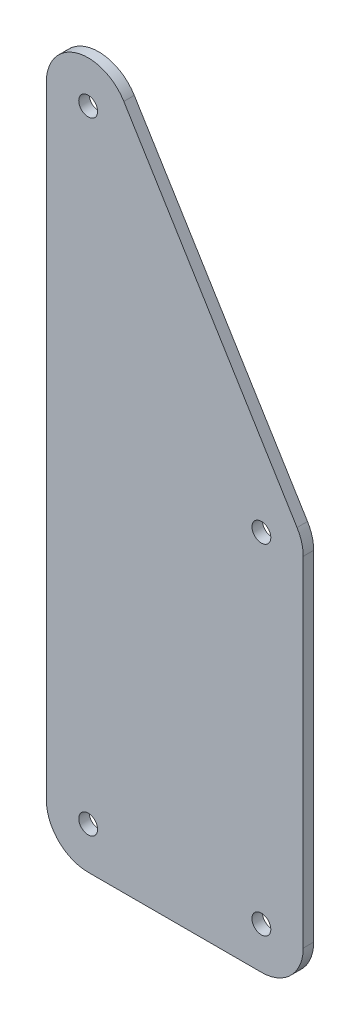
ISO-10303-21;
HEADER;
FILE_DESCRIPTION(('STEP AP214'),'2;1');
FILE_NAME('part.step','',(''),(''),'','','');
FILE_SCHEMA(('AUTOMOTIVE_DESIGN { 1 0 10303 214 1 1 1 1 }'));
ENDSEC;
DATA;
#1=APPLICATION_CONTEXT('core data for automotive mechanical design processes');
#2=APPLICATION_PROTOCOL_DEFINITION('international standard','automotive_design',2000,#1);
#3=PRODUCT_CONTEXT('',#1,'mechanical');
#4=PRODUCT('Part','Part','',(#3));
#5=PRODUCT_RELATED_PRODUCT_CATEGORY('part','',(#4));
#6=PRODUCT_DEFINITION_FORMATION('','',#4);
#7=PRODUCT_DEFINITION_CONTEXT('part definition',#1,'design');
#8=PRODUCT_DEFINITION('design','',#6,#7);
#9=PRODUCT_DEFINITION_SHAPE('','',#8);
#10=(LENGTH_UNIT() NAMED_UNIT(*) SI_UNIT(.MILLI.,.METRE.));
#11=(NAMED_UNIT(*) PLANE_ANGLE_UNIT() SI_UNIT($,.RADIAN.));
#12=(NAMED_UNIT(*) SI_UNIT($,.STERADIAN.) SOLID_ANGLE_UNIT());
#13=UNCERTAINTY_MEASURE_WITH_UNIT(LENGTH_MEASURE(1.E-05),#10,'distance_accuracy_value','');
#14=(GEOMETRIC_REPRESENTATION_CONTEXT(3) GLOBAL_UNCERTAINTY_ASSIGNED_CONTEXT((#13)) GLOBAL_UNIT_ASSIGNED_CONTEXT((#10,
#11,#12)) REPRESENTATION_CONTEXT('',''));
#15=CARTESIAN_POINT('',(0.,0.,0.));
#16=DIRECTION('',(0.,0.,1.));
#17=DIRECTION('',(1.,0.,0.));
#18=AXIS2_PLACEMENT_3D('',#15,#16,#17);
#19=CARTESIAN_POINT('',(32.,507.485708837795,-8.));
#20=DIRECTION('',(0.,0.,1.));
#21=DIRECTION('',(-1.,0.,0.));
#22=AXIS2_PLACEMENT_3D('',#19,#20,#21);
#23=CYLINDRICAL_SURFACE('',#22,32.);
#24=CARTESIAN_POINT('',(32.,507.485708837795,0.));
#25=DIRECTION('',(0.,0.,1.));
#26=DIRECTION('',(-1.,0.,0.));
#27=AXIS2_PLACEMENT_3D('',#24,#25,#26);
#28=CIRCLE('',#27,32.);
#29=CARTESIAN_POINT('',(59.2779224328877,524.216367753252,0.));
#30=VERTEX_POINT('',#29);
#31=CARTESIAN_POINT('',(0.,507.485708837794,0.));
#32=VERTEX_POINT('',#31);
#33=EDGE_CURVE('E139',#30,#32,#28,.T.);
#34=ORIENTED_EDGE('',*,*,#33,.F.);
#35=DIRECTION('',(0.,0.,1.));
#36=VECTOR('',#35,1.);
#37=CARTESIAN_POINT('',(59.2779224328877,524.216367753252,-8.));
#38=LINE('',#37,#36);
#39=CARTESIAN_POINT('',(59.2779224328877,524.216367753252,-8.));
#40=VERTEX_POINT('',#39);
#41=EDGE_CURVE('E138',#40,#30,#38,.T.);
#42=ORIENTED_EDGE('',*,*,#41,.F.);
#43=CARTESIAN_POINT('',(32.,507.485708837795,-8.));
#44=DIRECTION('',(0.,0.,1.));
#45=DIRECTION('',(-1.,0.,0.));
#46=AXIS2_PLACEMENT_3D('',#43,#44,#45);
#47=CIRCLE('',#46,32.);
#48=CARTESIAN_POINT('',(0.,507.485708837794,-8.));
#49=VERTEX_POINT('',#48);
#50=EDGE_CURVE('E158',#40,#49,#47,.T.);
#51=ORIENTED_EDGE('',*,*,#50,.T.);
#52=DIRECTION('',(0.,0.,1.));
#53=VECTOR('',#52,1.);
#54=CARTESIAN_POINT('',(0.,507.485708837794,-8.));
#55=LINE('',#54,#53);
#56=EDGE_CURVE('E11',#49,#32,#55,.T.);
#57=ORIENTED_EDGE('',*,*,#56,.T.);
#58=EDGE_LOOP('',(#34,#42,#51,#57));
#59=FACE_BOUND('',#58,.T.);
#60=ADVANCED_FACE('F43',(#59),#23,.T.);
#61=CARTESIAN_POINT('',(0.,32.0000000000002,-8.));
#62=DIRECTION('',(1.,0.,0.));
#63=DIRECTION('',(0.,0.,1.));
#64=AXIS2_PLACEMENT_3D('',#61,#62,#63);
#65=PLANE('',#64);
#66=DIRECTION('',(0.,-1.,0.));
#67=VECTOR('',#66,1.);
#68=CARTESIAN_POINT('',(0.,32.0000000000002,0.));
#69=LINE('',#68,#67);
#70=CARTESIAN_POINT('',(0.,32.0000000000002,0.));
#71=VERTEX_POINT('',#70);
#72=EDGE_CURVE('E143',#32,#71,#69,.T.);
#73=ORIENTED_EDGE('',*,*,#72,.F.);
#74=ORIENTED_EDGE('',*,*,#56,.F.);
#75=DIRECTION('',(0.,-1.,0.));
#76=VECTOR('',#75,1.);
#77=CARTESIAN_POINT('',(0.,32.0000000000002,-8.));
#78=LINE('',#77,#76);
#79=CARTESIAN_POINT('',(0.,32.0000000000002,-8.));
#80=VERTEX_POINT('',#79);
#81=EDGE_CURVE('E100',#49,#80,#78,.T.);
#82=ORIENTED_EDGE('',*,*,#81,.T.);
#83=DIRECTION('',(0.,0.,1.));
#84=VECTOR('',#83,1.);
#85=CARTESIAN_POINT('',(0.,32.0000000000002,-8.));
#86=LINE('',#85,#84);
#87=EDGE_CURVE('E51',#80,#71,#86,.T.);
#88=ORIENTED_EDGE('',*,*,#87,.T.);
#89=EDGE_LOOP('',(#73,#74,#82,#88));
#90=FACE_BOUND('',#89,.T.);
#91=ADVANCED_FACE('F168',(#90),#65,.F.);
#92=CARTESIAN_POINT('',(32.,32.,-8.));
#93=DIRECTION('',(0.,0.,1.));
#94=DIRECTION('',(-1.,0.,0.));
#95=AXIS2_PLACEMENT_3D('',#92,#93,#94);
#96=CYLINDRICAL_SURFACE('',#95,32.);
#97=CARTESIAN_POINT('',(32.,32.,0.));
#98=DIRECTION('',(0.,0.,1.));
#99=DIRECTION('',(-1.,0.,0.));
#100=AXIS2_PLACEMENT_3D('',#97,#98,#99);
#101=CIRCLE('',#100,32.);
#102=CARTESIAN_POINT('',(32.0000000000002,0.,0.));
#103=VERTEX_POINT('',#102);
#104=EDGE_CURVE('E144',#71,#103,#101,.T.);
#105=ORIENTED_EDGE('',*,*,#104,.F.);
#106=ORIENTED_EDGE('',*,*,#87,.F.);
#107=CARTESIAN_POINT('',(32.,32.,-8.));
#108=DIRECTION('',(0.,0.,1.));
#109=DIRECTION('',(-1.,0.,0.));
#110=AXIS2_PLACEMENT_3D('',#107,#108,#109);
#111=CIRCLE('',#110,32.);
#112=CARTESIAN_POINT('',(32.0000000000002,0.,-8.));
#113=VERTEX_POINT('',#112);
#114=EDGE_CURVE('E179',#80,#113,#111,.T.);
#115=ORIENTED_EDGE('',*,*,#114,.T.);
#116=DIRECTION('',(0.,0.,1.));
#117=VECTOR('',#116,1.);
#118=CARTESIAN_POINT('',(32.0000000000002,0.,-8.));
#119=LINE('',#118,#117);
#120=EDGE_CURVE('E164',#113,#103,#119,.T.);
#121=ORIENTED_EDGE('',*,*,#120,.T.);
#122=EDGE_LOOP('',(#105,#106,#115,#121));
#123=FACE_BOUND('',#122,.T.);
#124=ADVANCED_FACE('F192',(#123),#96,.T.);
#125=CARTESIAN_POINT('',(32.0000000000002,0.,-8.));
#126=DIRECTION('',(0.,1.,0.));
#127=DIRECTION('',(0.,0.,-1.));
#128=AXIS2_PLACEMENT_3D('',#125,#126,#127);
#129=PLANE('',#128);
#130=DIRECTION('',(1.,0.,0.));
#131=VECTOR('',#130,1.);
#132=CARTESIAN_POINT('',(32.0000000000002,0.,0.));
#133=LINE('',#132,#131);
#134=CARTESIAN_POINT('',(164.48,0.,0.));
#135=VERTEX_POINT('',#134);
#136=EDGE_CURVE('E146',#103,#135,#133,.T.);
#137=ORIENTED_EDGE('',*,*,#136,.F.);
#138=ORIENTED_EDGE('',*,*,#120,.F.);
#139=DIRECTION('',(1.,0.,0.));
#140=VECTOR('',#139,1.);
#141=CARTESIAN_POINT('',(32.0000000000002,0.,-8.));
#142=LINE('',#141,#140);
#143=CARTESIAN_POINT('',(164.48,0.,-8.));
#144=VERTEX_POINT('',#143);
#145=EDGE_CURVE('E132',#113,#144,#142,.T.);
#146=ORIENTED_EDGE('',*,*,#145,.T.);
#147=DIRECTION('',(0.,0.,1.));
#148=VECTOR('',#147,1.);
#149=CARTESIAN_POINT('',(164.48,0.,-8.));
#150=LINE('',#149,#148);
#151=EDGE_CURVE('E165',#144,#135,#150,.T.);
#152=ORIENTED_EDGE('',*,*,#151,.T.);
#153=EDGE_LOOP('',(#137,#138,#146,#152));
#154=FACE_BOUND('',#153,.T.);
#155=ADVANCED_FACE('F190',(#154),#129,.F.);
#156=CARTESIAN_POINT('',(164.48,32.,-8.));
#157=DIRECTION('',(0.,0.,1.));
#158=DIRECTION('',(-1.,0.,0.));
#159=AXIS2_PLACEMENT_3D('',#156,#157,#158);
#160=CYLINDRICAL_SURFACE('',#159,32.);
#161=CARTESIAN_POINT('',(164.48,32.,0.));
#162=DIRECTION('',(0.,0.,1.));
#163=DIRECTION('',(1.,0.,0.));
#164=AXIS2_PLACEMENT_3D('',#161,#162,#163);
#165=CIRCLE('',#164,32.);
#166=CARTESIAN_POINT('',(196.48,32.,0.));
#167=VERTEX_POINT('',#166);
#168=EDGE_CURVE('E151',#135,#167,#165,.T.);
#169=ORIENTED_EDGE('',*,*,#168,.F.);
#170=ORIENTED_EDGE('',*,*,#151,.F.);
#171=CARTESIAN_POINT('',(164.48,32.,-8.));
#172=DIRECTION('',(0.,0.,1.));
#173=DIRECTION('',(1.,0.,0.));
#174=AXIS2_PLACEMENT_3D('',#171,#172,#173);
#175=CIRCLE('',#174,32.);
#176=CARTESIAN_POINT('',(196.48,32.,-8.));
#177=VERTEX_POINT('',#176);
#178=EDGE_CURVE('E131',#144,#177,#175,.T.);
#179=ORIENTED_EDGE('',*,*,#178,.T.);
#180=DIRECTION('',(0.,0.,1.));
#181=VECTOR('',#180,1.);
#182=CARTESIAN_POINT('',(196.48,32.,-8.));
#183=LINE('',#182,#181);
#184=EDGE_CURVE('E121',#177,#167,#183,.T.);
#185=ORIENTED_EDGE('',*,*,#184,.T.);
#186=EDGE_LOOP('',(#169,#170,#179,#185));
#187=FACE_BOUND('',#186,.T.);
#188=ADVANCED_FACE('F189',(#187),#160,.T.);
#189=CARTESIAN_POINT('',(196.48,32.0000000000002,-8.));
#190=DIRECTION('',(-1.,0.,0.));
#191=DIRECTION('',(0.,0.,-1.));
#192=AXIS2_PLACEMENT_3D('',#189,#190,#191);
#193=PLANE('',#192);
#194=DIRECTION('',(0.,1.,0.));
#195=VECTOR('',#194,1.);
#196=CARTESIAN_POINT('',(196.48,32.0000000000002,0.));
#197=LINE('',#196,#195);
#198=CARTESIAN_POINT('',(196.48,291.488288642355,0.));
#199=VERTEX_POINT('',#198);
#200=EDGE_CURVE('E152',#167,#199,#197,.T.);
#201=ORIENTED_EDGE('',*,*,#200,.F.);
#202=ORIENTED_EDGE('',*,*,#184,.F.);
#203=DIRECTION('',(0.,1.,0.));
#204=VECTOR('',#203,1.);
#205=CARTESIAN_POINT('',(196.48,32.0000000000002,-8.));
#206=LINE('',#205,#204);
#207=CARTESIAN_POINT('',(196.48,291.488288642355,-8.));
#208=VERTEX_POINT('',#207);
#209=EDGE_CURVE('E113',#177,#208,#206,.T.);
#210=ORIENTED_EDGE('',*,*,#209,.T.);
#211=DIRECTION('',(0.,0.,1.));
#212=VECTOR('',#211,1.);
#213=CARTESIAN_POINT('',(196.48,291.488288642355,-8.));
#214=LINE('',#213,#212);
#215=EDGE_CURVE('E119',#208,#199,#214,.T.);
#216=ORIENTED_EDGE('',*,*,#215,.T.);
#217=EDGE_LOOP('',(#201,#202,#210,#216));
#218=FACE_BOUND('',#217,.T.);
#219=ADVANCED_FACE('F126',(#218),#193,.F.);
#220=CARTESIAN_POINT('',(164.48,291.488288642356,-8.));
#221=DIRECTION('',(0.,0.,1.));
#222=DIRECTION('',(-1.,0.,0.));
#223=AXIS2_PLACEMENT_3D('',#220,#221,#222);
#224=CYLINDRICAL_SURFACE('',#223,32.);
#225=CARTESIAN_POINT('',(164.48,291.488288642356,0.));
#226=DIRECTION('',(0.,0.,1.));
#227=DIRECTION('',(1.,0.,0.));
#228=AXIS2_PLACEMENT_3D('',#225,#226,#227);
#229=CIRCLE('',#228,32.);
#230=CARTESIAN_POINT('',(191.757922432887,308.218947557814,0.));
#231=VERTEX_POINT('',#230);
#232=EDGE_CURVE('E125',#199,#231,#229,.T.);
#233=ORIENTED_EDGE('',*,*,#232,.F.);
#234=ORIENTED_EDGE('',*,*,#215,.F.);
#235=CARTESIAN_POINT('',(164.48,291.488288642356,-8.));
#236=DIRECTION('',(0.,0.,1.));
#237=DIRECTION('',(1.,0.,0.));
#238=AXIS2_PLACEMENT_3D('',#235,#236,#237);
#239=CIRCLE('',#238,32.);
#240=CARTESIAN_POINT('',(191.757922432887,308.218947557814,-8.));
#241=VERTEX_POINT('',#240);
#242=EDGE_CURVE('E112',#208,#241,#239,.T.);
#243=ORIENTED_EDGE('',*,*,#242,.T.);
#244=DIRECTION('',(0.,0.,1.));
#245=VECTOR('',#244,1.);
#246=CARTESIAN_POINT('',(191.757922432887,308.218947557814,-8.));
#247=LINE('',#246,#245);
#248=EDGE_CURVE('E127',#241,#231,#247,.T.);
#249=ORIENTED_EDGE('',*,*,#248,.T.);
#250=EDGE_LOOP('',(#233,#234,#243,#249));
#251=FACE_BOUND('',#250,.T.);
#252=ADVANCED_FACE('F122',(#251),#224,.T.);
#253=CARTESIAN_POINT('',(59.2779224328877,524.216367753252,-8.));
#254=DIRECTION('',(-0.852435076027714,-0.522833091108075,0.));
#255=DIRECTION('',(0.522833091108075,-0.852435076027714,0.));
#256=AXIS2_PLACEMENT_3D('',#253,#254,#255);
#257=PLANE('',#256);
#258=DIRECTION('',(-0.522833091108075,0.852435076027714,0.));
#259=VECTOR('',#258,1.);
#260=CARTESIAN_POINT('',(59.2779224328877,524.216367753252,0.));
#261=LINE('',#260,#259);
#262=EDGE_CURVE('E81',#231,#30,#261,.T.);
#263=ORIENTED_EDGE('',*,*,#262,.F.);
#264=ORIENTED_EDGE('',*,*,#248,.F.);
#265=DIRECTION('',(-0.522833091108075,0.852435076027714,0.));
#266=VECTOR('',#265,1.);
#267=CARTESIAN_POINT('',(59.2779224328877,524.216367753252,-8.));
#268=LINE('',#267,#266);
#269=EDGE_CURVE('E56',#241,#40,#268,.T.);
#270=ORIENTED_EDGE('',*,*,#269,.T.);
#271=ORIENTED_EDGE('',*,*,#41,.T.);
#272=EDGE_LOOP('',(#263,#264,#270,#271));
#273=FACE_BOUND('',#272,.T.);
#274=ADVANCED_FACE('F242',(#273),#257,.F.);
#275=CARTESIAN_POINT('',(32.,507.485708837795,-8.));
#276=DIRECTION('',(0.,0.,1.));
#277=DIRECTION('',(-1.,0.,0.));
#278=AXIS2_PLACEMENT_3D('',#275,#276,#277);
#279=PLANE('',#278);
#280=CARTESIAN_POINT('',(32.,507.485708837795,-8.));
#281=DIRECTION('',(0.,0.,-1.));
#282=DIRECTION('',(-1.,0.,0.));
#283=AXIS2_PLACEMENT_3D('',#280,#281,#282);
#284=CIRCLE('',#283,7.19999999999996);
#285=CARTESIAN_POINT('',(24.8,507.485708837795,-8.));
#286=VERTEX_POINT('',#285);
#287=EDGE_CURVE('E142',#286,#286,#284,.T.);
#288=ORIENTED_EDGE('',*,*,#287,.F.);
#289=EDGE_LOOP('',(#288));
#290=FACE_BOUND('',#289,.T.);
#291=CARTESIAN_POINT('',(164.48,32.,-8.));
#292=DIRECTION('',(0.,0.,-1.));
#293=DIRECTION('',(-1.,0.,0.));
#294=AXIS2_PLACEMENT_3D('',#291,#292,#293);
#295=CIRCLE('',#294,7.19999999999998);
#296=CARTESIAN_POINT('',(157.28,32.,-8.));
#297=VERTEX_POINT('',#296);
#298=EDGE_CURVE('E318',#297,#297,#295,.T.);
#299=ORIENTED_EDGE('',*,*,#298,.F.);
#300=EDGE_LOOP('',(#299));
#301=FACE_BOUND('',#300,.T.);
#302=CARTESIAN_POINT('',(32.,32.,-8.));
#303=DIRECTION('',(0.,0.,-1.));
#304=DIRECTION('',(-1.,0.,0.));
#305=AXIS2_PLACEMENT_3D('',#302,#303,#304);
#306=CIRCLE('',#305,7.2);
#307=CARTESIAN_POINT('',(24.8,32.,-8.));
#308=VERTEX_POINT('',#307);
#309=EDGE_CURVE('E319',#308,#308,#306,.T.);
#310=ORIENTED_EDGE('',*,*,#309,.F.);
#311=EDGE_LOOP('',(#310));
#312=FACE_BOUND('',#311,.T.);
#313=CARTESIAN_POINT('',(164.48,291.488288642356,-8.));
#314=DIRECTION('',(0.,0.,-1.));
#315=DIRECTION('',(-1.,0.,0.));
#316=AXIS2_PLACEMENT_3D('',#313,#314,#315);
#317=CIRCLE('',#316,7.20000000000002);
#318=CARTESIAN_POINT('',(157.28,291.488288642356,-8.));
#319=VERTEX_POINT('',#318);
#320=EDGE_CURVE('E322',#319,#319,#317,.T.);
#321=ORIENTED_EDGE('',*,*,#320,.F.);
#322=EDGE_LOOP('',(#321));
#323=FACE_BOUND('',#322,.T.);
#324=ORIENTED_EDGE('',*,*,#50,.F.);
#325=ORIENTED_EDGE('',*,*,#269,.F.);
#326=ORIENTED_EDGE('',*,*,#242,.F.);
#327=ORIENTED_EDGE('',*,*,#209,.F.);
#328=ORIENTED_EDGE('',*,*,#178,.F.);
#329=ORIENTED_EDGE('',*,*,#145,.F.);
#330=ORIENTED_EDGE('',*,*,#114,.F.);
#331=ORIENTED_EDGE('',*,*,#81,.F.);
#332=EDGE_LOOP('',(#324,#325,#326,#327,#328,#329,#330,#331));
#333=FACE_BOUND('',#332,.T.);
#334=ADVANCED_FACE('F114',(#290,#301,#312,#323,#333),#279,.F.);
#335=CARTESIAN_POINT('',(32.,507.485708837795,0.));
#336=DIRECTION('',(0.,0.,1.));
#337=DIRECTION('',(-1.,0.,0.));
#338=AXIS2_PLACEMENT_3D('',#335,#336,#337);
#339=PLANE('',#338);
#340=CARTESIAN_POINT('',(32.,507.485708837795,0.));
#341=DIRECTION('',(0.,0.,-1.));
#342=DIRECTION('',(-1.,0.,0.));
#343=AXIS2_PLACEMENT_3D('',#340,#341,#342);
#344=CIRCLE('',#343,7.19999999999996);
#345=CARTESIAN_POINT('',(24.8,507.485708837795,0.));
#346=VERTEX_POINT('',#345);
#347=EDGE_CURVE('E312',#346,#346,#344,.T.);
#348=ORIENTED_EDGE('',*,*,#347,.T.);
#349=EDGE_LOOP('',(#348));
#350=FACE_BOUND('',#349,.T.);
#351=CARTESIAN_POINT('',(164.48,32.,0.));
#352=DIRECTION('',(0.,0.,-1.));
#353=DIRECTION('',(-1.,0.,0.));
#354=AXIS2_PLACEMENT_3D('',#351,#352,#353);
#355=CIRCLE('',#354,7.19999999999998);
#356=CARTESIAN_POINT('',(157.28,32.,0.));
#357=VERTEX_POINT('',#356);
#358=EDGE_CURVE('E334',#357,#357,#355,.T.);
#359=ORIENTED_EDGE('',*,*,#358,.T.);
#360=EDGE_LOOP('',(#359));
#361=FACE_BOUND('',#360,.T.);
#362=CARTESIAN_POINT('',(32.,32.,0.));
#363=DIRECTION('',(0.,0.,-1.));
#364=DIRECTION('',(-1.,0.,0.));
#365=AXIS2_PLACEMENT_3D('',#362,#363,#364);
#366=CIRCLE('',#365,7.2);
#367=CARTESIAN_POINT('',(24.8,32.,0.));
#368=VERTEX_POINT('',#367);
#369=EDGE_CURVE('E328',#368,#368,#366,.T.);
#370=ORIENTED_EDGE('',*,*,#369,.T.);
#371=EDGE_LOOP('',(#370));
#372=FACE_BOUND('',#371,.T.);
#373=CARTESIAN_POINT('',(164.48,291.488288642356,0.));
#374=DIRECTION('',(0.,0.,-1.));
#375=DIRECTION('',(-1.,0.,0.));
#376=AXIS2_PLACEMENT_3D('',#373,#374,#375);
#377=CIRCLE('',#376,7.20000000000002);
#378=CARTESIAN_POINT('',(157.28,291.488288642356,0.));
#379=VERTEX_POINT('',#378);
#380=EDGE_CURVE('E335',#379,#379,#377,.T.);
#381=ORIENTED_EDGE('',*,*,#380,.T.);
#382=EDGE_LOOP('',(#381));
#383=FACE_BOUND('',#382,.T.);
#384=ORIENTED_EDGE('',*,*,#33,.T.);
#385=ORIENTED_EDGE('',*,*,#72,.T.);
#386=ORIENTED_EDGE('',*,*,#104,.T.);
#387=ORIENTED_EDGE('',*,*,#136,.T.);
#388=ORIENTED_EDGE('',*,*,#168,.T.);
#389=ORIENTED_EDGE('',*,*,#200,.T.);
#390=ORIENTED_EDGE('',*,*,#232,.T.);
#391=ORIENTED_EDGE('',*,*,#262,.T.);
#392=EDGE_LOOP('',(#384,#385,#386,#387,#388,#389,#390,#391));
#393=FACE_BOUND('',#392,.T.);
#394=ADVANCED_FACE('F172',(#350,#361,#372,#383,#393),#339,.T.);
#395=CARTESIAN_POINT('',(164.48,291.488288642356,-16.));
#396=DIRECTION('',(0.,0.,1.));
#397=DIRECTION('',(-1.,0.,0.));
#398=AXIS2_PLACEMENT_3D('',#395,#396,#397);
#399=CYLINDRICAL_SURFACE('',#398,7.20000000000002);
#400=ORIENTED_EDGE('',*,*,#380,.F.);
#401=EDGE_LOOP('',(#400));
#402=FACE_BOUND('',#401,.T.);
#403=ORIENTED_EDGE('',*,*,#320,.T.);
#404=EDGE_LOOP('',(#403));
#405=FACE_BOUND('',#404,.T.);
#406=ADVANCED_FACE('F271',(#402,#405),#399,.F.);
#407=CARTESIAN_POINT('',(32.,32.,-16.));
#408=DIRECTION('',(0.,0.,1.));
#409=DIRECTION('',(-1.,0.,0.));
#410=AXIS2_PLACEMENT_3D('',#407,#408,#409);
#411=CYLINDRICAL_SURFACE('',#410,7.2);
#412=ORIENTED_EDGE('',*,*,#369,.F.);
#413=EDGE_LOOP('',(#412));
#414=FACE_BOUND('',#413,.T.);
#415=ORIENTED_EDGE('',*,*,#309,.T.);
#416=EDGE_LOOP('',(#415));
#417=FACE_BOUND('',#416,.T.);
#418=ADVANCED_FACE('F278',(#414,#417),#411,.F.);
#419=CARTESIAN_POINT('',(164.48,32.,-16.));
#420=DIRECTION('',(0.,0.,1.));
#421=DIRECTION('',(-1.,0.,0.));
#422=AXIS2_PLACEMENT_3D('',#419,#420,#421);
#423=CYLINDRICAL_SURFACE('',#422,7.19999999999998);
#424=ORIENTED_EDGE('',*,*,#358,.F.);
#425=EDGE_LOOP('',(#424));
#426=FACE_BOUND('',#425,.T.);
#427=ORIENTED_EDGE('',*,*,#298,.T.);
#428=EDGE_LOOP('',(#427));
#429=FACE_BOUND('',#428,.T.);
#430=ADVANCED_FACE('F289',(#426,#429),#423,.F.);
#431=CARTESIAN_POINT('',(32.,507.485708837795,-16.));
#432=DIRECTION('',(0.,0.,1.));
#433=DIRECTION('',(-1.,0.,0.));
#434=AXIS2_PLACEMENT_3D('',#431,#432,#433);
#435=CYLINDRICAL_SURFACE('',#434,7.19999999999996);
#436=ORIENTED_EDGE('',*,*,#347,.F.);
#437=EDGE_LOOP('',(#436));
#438=FACE_BOUND('',#437,.T.);
#439=ORIENTED_EDGE('',*,*,#287,.T.);
#440=EDGE_LOOP('',(#439));
#441=FACE_BOUND('',#440,.T.);
#442=ADVANCED_FACE('F298',(#438,#441),#435,.F.);
#443=CLOSED_SHELL('',(#60,#91,#124,#155,#188,#219,#252,#274,#334,#394,#406,#418,#430,#442));
#444=MANIFOLD_SOLID_BREP('B2',#443);
#445=ADVANCED_BREP_SHAPE_REPRESENTATION('',(#18,#444),#14);
#446=SHAPE_DEFINITION_REPRESENTATION(#9,#445);
ENDSEC;
END-ISO-10303-21;
